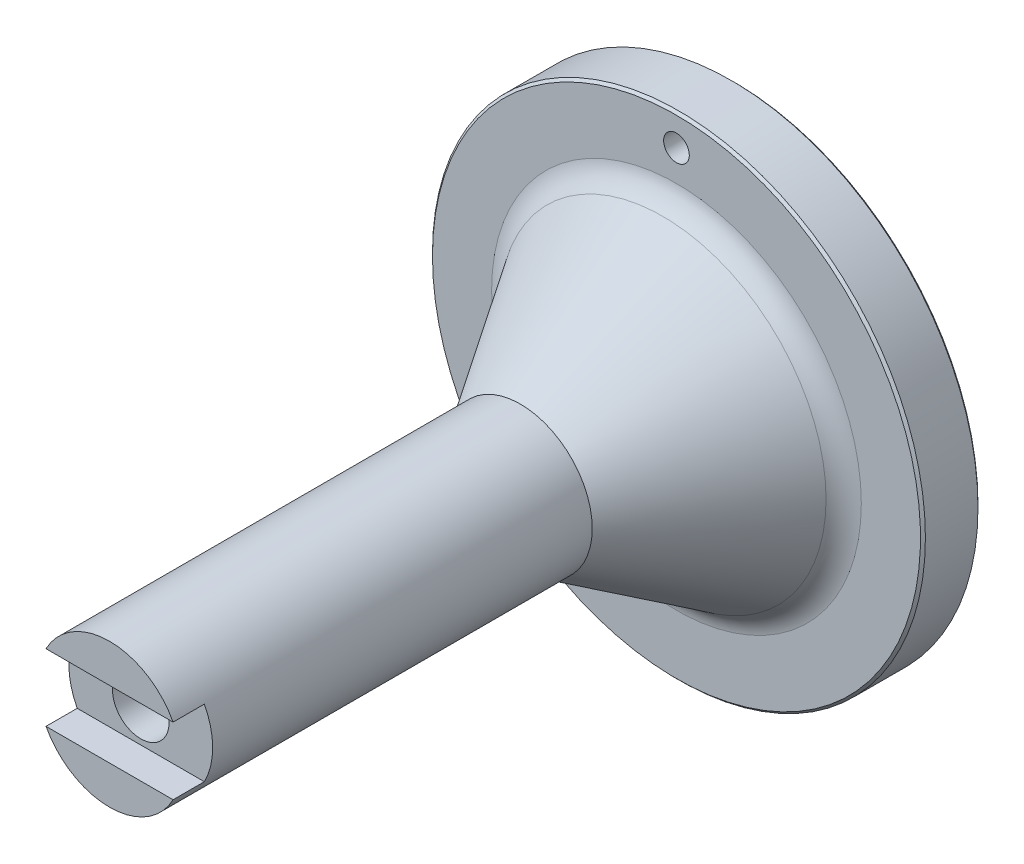
ISO-10303-21;
HEADER;
FILE_DESCRIPTION(('STEP AP214'),'2;1');
FILE_NAME('part.step','',(''),(''),'','','');
FILE_SCHEMA(('AUTOMOTIVE_DESIGN { 1 0 10303 214 1 1 1 1 }'));
ENDSEC;
DATA;
#1=APPLICATION_CONTEXT('core data for automotive mechanical design processes');
#2=APPLICATION_PROTOCOL_DEFINITION('international standard','automotive_design',2000,#1);
#3=PRODUCT_CONTEXT('',#1,'mechanical');
#4=PRODUCT('Part','Part','',(#3));
#5=PRODUCT_RELATED_PRODUCT_CATEGORY('part','',(#4));
#6=PRODUCT_DEFINITION_FORMATION('','',#4);
#7=PRODUCT_DEFINITION_CONTEXT('part definition',#1,'design');
#8=PRODUCT_DEFINITION('design','',#6,#7);
#9=PRODUCT_DEFINITION_SHAPE('','',#8);
#10=(LENGTH_UNIT() NAMED_UNIT(*) SI_UNIT(.MILLI.,.METRE.));
#11=(NAMED_UNIT(*) PLANE_ANGLE_UNIT() SI_UNIT($,.RADIAN.));
#12=(NAMED_UNIT(*) SI_UNIT($,.STERADIAN.) SOLID_ANGLE_UNIT());
#13=UNCERTAINTY_MEASURE_WITH_UNIT(LENGTH_MEASURE(1.E-05),#10,'distance_accuracy_value','');
#14=(GEOMETRIC_REPRESENTATION_CONTEXT(3) GLOBAL_UNCERTAINTY_ASSIGNED_CONTEXT((#13)) GLOBAL_UNIT_ASSIGNED_CONTEXT((#10,
#11,#12)) REPRESENTATION_CONTEXT('',''));
#15=CARTESIAN_POINT('',(0.,0.,0.));
#16=DIRECTION('',(0.,0.,1.));
#17=DIRECTION('',(1.,0.,0.));
#18=AXIS2_PLACEMENT_3D('',#15,#16,#17);
#19=CARTESIAN_POINT('',(0.,8.7376,0.));
#20=DIRECTION('',(0.,0.,-1.));
#21=DIRECTION('',(-1.,0.,0.));
#22=AXIS2_PLACEMENT_3D('',#19,#20,#21);
#23=PLANE('',#22);
#24=CARTESIAN_POINT('',(0.,0.,0.));
#25=DIRECTION('',(0.,0.,1.));
#26=DIRECTION('',(1.,0.,0.));
#27=AXIS2_PLACEMENT_3D('',#24,#25,#26);
#28=CIRCLE('',#27,22.225);
#29=CARTESIAN_POINT('',(19.6475854760833,10.3886,0.));
#30=VERTEX_POINT('',#29);
#31=CARTESIAN_POINT('',(-19.6475854760833,10.3886,0.));
#32=VERTEX_POINT('',#31);
#33=EDGE_CURVE('E141',#30,#32,#28,.T.);
#34=ORIENTED_EDGE('',*,*,#33,.T.);
#35=DIRECTION('',(1.,0.,0.));
#36=VECTOR('',#35,1.);
#37=CARTESIAN_POINT('',(-76.2,10.3886,0.));
#38=LINE('',#37,#36);
#39=EDGE_CURVE('E87',#32,#30,#38,.T.);
#40=ORIENTED_EDGE('',*,*,#39,.T.);
#41=EDGE_LOOP('',(#34,#40));
#42=FACE_BOUND('',#41,.T.);
#43=ADVANCED_FACE('F40',(#42),#23,.F.);
#44=CARTESIAN_POINT('',(0.,0.,0.));
#45=DIRECTION('',(0.,0.,1.));
#46=DIRECTION('',(1.,0.,0.));
#47=AXIS2_PLACEMENT_3D('',#44,#45,#46);
#48=CYLINDRICAL_SURFACE('',#47,22.225);
#49=ORIENTED_EDGE('',*,*,#33,.F.);
#50=DIRECTION('',(0.,0.,1.));
#51=VECTOR('',#50,1.);
#52=CARTESIAN_POINT('',(19.6475854760833,10.3886,0.));
#53=LINE('',#52,#51);
#54=CARTESIAN_POINT('',(19.6475854760833,10.3886,-9.652));
#55=VERTEX_POINT('',#54);
#56=EDGE_CURVE('E65',#30,#55,#53,.F.);
#57=ORIENTED_EDGE('',*,*,#56,.T.);
#58=CARTESIAN_POINT('',(0.,0.,-9.652));
#59=DIRECTION('',(0.,0.,-1.));
#60=DIRECTION('',(0.,1.,0.));
#61=AXIS2_PLACEMENT_3D('',#58,#59,#60);
#62=CIRCLE('',#61,22.225);
#63=CARTESIAN_POINT('',(19.6475854760833,-10.3886,-9.652));
#64=VERTEX_POINT('',#63);
#65=EDGE_CURVE('E99',#55,#64,#62,.T.);
#66=ORIENTED_EDGE('',*,*,#65,.T.);
#67=DIRECTION('',(0.,0.,1.));
#68=VECTOR('',#67,1.);
#69=CARTESIAN_POINT('',(19.6475854760833,-10.3886,0.));
#70=LINE('',#69,#68);
#71=CARTESIAN_POINT('',(19.6475854760833,-10.3886,0.));
#72=VERTEX_POINT('',#71);
#73=EDGE_CURVE('E113',#64,#72,#70,.T.);
#74=ORIENTED_EDGE('',*,*,#73,.T.);
#75=CARTESIAN_POINT('',(-19.6475854760833,-10.3886,0.));
#76=VERTEX_POINT('',#75);
#77=EDGE_CURVE('E140',#76,#72,#28,.T.);
#78=ORIENTED_EDGE('',*,*,#77,.F.);
#79=DIRECTION('',(0.,0.,1.));
#80=VECTOR('',#79,1.);
#81=CARTESIAN_POINT('',(-19.6475854760833,-10.3886,0.));
#82=LINE('',#81,#80);
#83=CARTESIAN_POINT('',(-19.6475854760833,-10.3886,-9.652));
#84=VERTEX_POINT('',#83);
#85=EDGE_CURVE('E57',#76,#84,#82,.F.);
#86=ORIENTED_EDGE('',*,*,#85,.T.);
#87=CARTESIAN_POINT('',(-19.6475854760833,10.3886,-9.652));
#88=VERTEX_POINT('',#87);
#89=EDGE_CURVE('E97',#84,#88,#62,.T.);
#90=ORIENTED_EDGE('',*,*,#89,.T.);
#91=DIRECTION('',(0.,0.,1.));
#92=VECTOR('',#91,1.);
#93=CARTESIAN_POINT('',(-19.6475854760833,10.3886,0.));
#94=LINE('',#93,#92);
#95=EDGE_CURVE('E83',#88,#32,#94,.T.);
#96=ORIENTED_EDGE('',*,*,#95,.T.);
#97=EDGE_LOOP('',(#49,#57,#66,#74,#78,#86,#90,#96));
#98=FACE_BOUND('',#97,.T.);
#99=CARTESIAN_POINT('',(0.,0.,-127.));
#100=DIRECTION('',(0.,0.,1.));
#101=DIRECTION('',(1.,0.,0.));
#102=AXIS2_PLACEMENT_3D('',#99,#100,#101);
#103=CIRCLE('',#102,22.225);
#104=CARTESIAN_POINT('',(22.225,0.,-127.));
#105=VERTEX_POINT('',#104);
#106=EDGE_CURVE('E92',#105,#105,#103,.T.);
#107=ORIENTED_EDGE('',*,*,#106,.T.);
#108=EDGE_LOOP('',(#107));
#109=FACE_BOUND('',#108,.T.);
#110=ADVANCED_FACE('F102',(#98,#109),#48,.T.);
#111=ORIENTED_EDGE('',*,*,#77,.T.);
#112=DIRECTION('',(1.,0.,0.));
#113=VECTOR('',#112,1.);
#114=CARTESIAN_POINT('',(-76.2,-10.3886,0.));
#115=LINE('',#114,#113);
#116=EDGE_CURVE('E110',#76,#72,#115,.T.);
#117=ORIENTED_EDGE('',*,*,#116,.F.);
#118=EDGE_LOOP('',(#111,#117));
#119=FACE_BOUND('',#118,.T.);
#120=ADVANCED_FACE('F191',(#119),#23,.F.);
#121=CARTESIAN_POINT('',(0.,0.,0.));
#122=DIRECTION('',(0.,0.,1.));
#123=DIRECTION('',(1.,0.,0.));
#124=AXIS2_PLACEMENT_3D('',#121,#122,#123);
#125=CYLINDRICAL_SURFACE('',#124,8.7376);
#126=CARTESIAN_POINT('',(0.,0.,-9.652));
#127=DIRECTION('',(0.,0.,-1.));
#128=DIRECTION('',(0.,1.,0.));
#129=AXIS2_PLACEMENT_3D('',#126,#127,#128);
#130=CIRCLE('',#129,8.7376);
#131=CARTESIAN_POINT('',(0.,8.7376,-9.652));
#132=VERTEX_POINT('',#131);
#133=EDGE_CURVE('E105',#132,#132,#130,.F.);
#134=ORIENTED_EDGE('',*,*,#133,.T.);
#135=EDGE_LOOP('',(#134));
#136=FACE_BOUND('',#135,.T.);
#137=CARTESIAN_POINT('',(0.,0.,-185.1152));
#138=DIRECTION('',(0.,0.,1.));
#139=DIRECTION('',(1.,0.,0.));
#140=AXIS2_PLACEMENT_3D('',#137,#138,#139);
#141=CIRCLE('',#140,8.7376);
#142=CARTESIAN_POINT('',(8.7376,0.,-185.1152));
#143=VERTEX_POINT('',#142);
#144=EDGE_CURVE('E137',#143,#143,#141,.T.);
#145=ORIENTED_EDGE('',*,*,#144,.F.);
#146=EDGE_LOOP('',(#145));
#147=FACE_BOUND('',#146,.T.);
#148=ADVANCED_FACE('F198',(#136,#147),#125,.F.);
#149=CARTESIAN_POINT('',(0.,15.875,-185.1152));
#150=DIRECTION('',(0.,0.,1.));
#151=DIRECTION('',(1.,0.,0.));
#152=AXIS2_PLACEMENT_3D('',#149,#150,#151);
#153=PLANE('',#152);
#154=CARTESIAN_POINT('',(0.,0.,-185.1152));
#155=DIRECTION('',(0.,0.,1.));
#156=DIRECTION('',(1.,0.,0.));
#157=AXIS2_PLACEMENT_3D('',#154,#155,#156);
#158=CIRCLE('',#157,15.875);
#159=CARTESIAN_POINT('',(15.875,0.,-185.1152));
#160=VERTEX_POINT('',#159);
#161=EDGE_CURVE('E134',#160,#160,#158,.T.);
#162=ORIENTED_EDGE('',*,*,#161,.F.);
#163=EDGE_LOOP('',(#162));
#164=FACE_BOUND('',#163,.T.);
#165=ORIENTED_EDGE('',*,*,#144,.T.);
#166=EDGE_LOOP('',(#165));
#167=FACE_BOUND('',#166,.T.);
#168=ADVANCED_FACE('F203',(#164,#167),#153,.F.);
#169=CARTESIAN_POINT('',(0.,0.,-185.1152));
#170=DIRECTION('',(0.,0.,1.));
#171=DIRECTION('',(1.,0.,0.));
#172=AXIS2_PLACEMENT_3D('',#169,#170,#171);
#173=CONICAL_SURFACE('',#172,15.875,0.785398163397444);
#174=CARTESIAN_POINT('',(0.,0.,-171.452793139199));
#175=DIRECTION('',(0.,0.,1.));
#176=DIRECTION('',(1.,0.,0.));
#177=AXIS2_PLACEMENT_3D('',#174,#175,#176);
#178=CIRCLE('',#177,29.5374068608008);
#179=CARTESIAN_POINT('',(29.5374068608008,0.,-171.452793139199));
#180=VERTEX_POINT('',#179);
#181=EDGE_CURVE('E131',#180,#180,#178,.T.);
#182=ORIENTED_EDGE('',*,*,#181,.F.);
#183=EDGE_LOOP('',(#182));
#184=FACE_BOUND('',#183,.T.);
#185=ORIENTED_EDGE('',*,*,#161,.T.);
#186=EDGE_LOOP('',(#185));
#187=FACE_BOUND('',#186,.T.);
#188=ADVANCED_FACE('F346',(#184,#187),#173,.T.);
#189=CARTESIAN_POINT('',(0.,0.,-178.187985230001));
#190=DIRECTION('',(0.,0.,1.));
#191=DIRECTION('',(1.,0.,0.));
#192=AXIS2_PLACEMENT_3D('',#189,#190,#191);
#193=TOROIDAL_SURFACE('',#192,36.2725989516027,9.52499999999998);
#194=CARTESIAN_POINT('',(0.,0.,-173.035490372764));
#195=DIRECTION('',(0.,0.,1.));
#196=DIRECTION('',(1.,0.,0.));
#197=AXIS2_PLACEMENT_3D('',#194,#195,#196);
#198=CIRCLE('',#197,44.2836801361961);
#199=CARTESIAN_POINT('',(44.2836801361961,0.,-173.035490372764));
#200=VERTEX_POINT('',#199);
#201=EDGE_CURVE('E128',#200,#200,#198,.T.);
#202=ORIENTED_EDGE('',*,*,#201,.F.);
#203=EDGE_LOOP('',(#202));
#204=FACE_BOUND('',#203,.T.);
#205=ORIENTED_EDGE('',*,*,#181,.T.);
#206=EDGE_LOOP('',(#205));
#207=FACE_BOUND('',#206,.T.);
#208=ADVANCED_FACE('F355',(#204,#207),#193,.F.);
#209=CARTESIAN_POINT('',(0.,0.,-173.035490372764));
#210=DIRECTION('',(0.,0.,-1.));
#211=DIRECTION('',(-1.,0.,0.));
#212=AXIS2_PLACEMENT_3D('',#209,#210,#211);
#213=CONICAL_SURFACE('',#212,44.2836801361961,0.571559506417965);
#214=CARTESIAN_POINT('',(0.,0.,-193.04));
#215=DIRECTION('',(0.,0.,1.));
#216=DIRECTION('',(1.,0.,0.));
#217=AXIS2_PLACEMENT_3D('',#214,#215,#216);
#218=CIRCLE('',#217,57.15);
#219=CARTESIAN_POINT('',(57.15,0.,-193.04));
#220=VERTEX_POINT('',#219);
#221=EDGE_CURVE('E125',#220,#220,#218,.T.);
#222=ORIENTED_EDGE('',*,*,#221,.F.);
#223=EDGE_LOOP('',(#222));
#224=FACE_BOUND('',#223,.T.);
#225=ORIENTED_EDGE('',*,*,#201,.T.);
#226=EDGE_LOOP('',(#225));
#227=FACE_BOUND('',#226,.T.);
#228=ADVANCED_FACE('F261',(#224,#227),#213,.F.);
#229=CARTESIAN_POINT('',(0.,76.2,-193.04));
#230=DIRECTION('',(0.,0.,1.));
#231=DIRECTION('',(1.,0.,0.));
#232=AXIS2_PLACEMENT_3D('',#229,#230,#231);
#233=PLANE('',#232);
#234=CARTESIAN_POINT('',(0.,66.675,-193.04));
#235=DIRECTION('',(0.,0.,-1.));
#236=DIRECTION('',(-1.,0.,0.));
#237=AXIS2_PLACEMENT_3D('',#234,#235,#236);
#238=CIRCLE('',#237,3.9624);
#239=CARTESIAN_POINT('',(-3.9624,66.675,-193.04));
#240=VERTEX_POINT('',#239);
#241=EDGE_CURVE('E209',#240,#240,#238,.T.);
#242=ORIENTED_EDGE('',*,*,#241,.F.);
#243=EDGE_LOOP('',(#242));
#244=FACE_BOUND('',#243,.T.);
#245=CARTESIAN_POINT('',(0.,0.,-193.04));
#246=DIRECTION('',(0.,0.,1.));
#247=DIRECTION('',(1.,0.,0.));
#248=AXIS2_PLACEMENT_3D('',#245,#246,#247);
#249=CIRCLE('',#248,75.438);
#250=CARTESIAN_POINT('',(75.438,0.,-193.04));
#251=VERTEX_POINT('',#250);
#252=EDGE_CURVE('E49',#251,#251,#249,.F.);
#253=ORIENTED_EDGE('',*,*,#252,.T.);
#254=EDGE_LOOP('',(#253));
#255=FACE_BOUND('',#254,.T.);
#256=ORIENTED_EDGE('',*,*,#221,.T.);
#257=EDGE_LOOP('',(#256));
#258=FACE_BOUND('',#257,.T.);
#259=ADVANCED_FACE('F152',(#244,#255,#258),#233,.F.);
#260=CARTESIAN_POINT('',(0.,0.,0.));
#261=DIRECTION('',(0.,0.,1.));
#262=DIRECTION('',(1.,0.,0.));
#263=AXIS2_PLACEMENT_3D('',#260,#261,#262);
#264=CYLINDRICAL_SURFACE('',#263,76.2);
#265=CARTESIAN_POINT('',(0.,0.,-192.278));
#266=DIRECTION('',(0.,0.,1.));
#267=DIRECTION('',(1.,0.,0.));
#268=AXIS2_PLACEMENT_3D('',#265,#266,#267);
#269=CIRCLE('',#268,76.2);
#270=CARTESIAN_POINT('',(76.2,0.,-192.278));
#271=VERTEX_POINT('',#270);
#272=EDGE_CURVE('E146',#271,#271,#269,.T.);
#273=ORIENTED_EDGE('',*,*,#272,.T.);
#274=EDGE_LOOP('',(#273));
#275=FACE_BOUND('',#274,.T.);
#276=CARTESIAN_POINT('',(0.,0.,-176.022));
#277=DIRECTION('',(0.,0.,-1.));
#278=DIRECTION('',(-1.,0.,0.));
#279=AXIS2_PLACEMENT_3D('',#276,#277,#278);
#280=CIRCLE('',#279,76.2);
#281=CARTESIAN_POINT('',(-76.2,0.,-176.022));
#282=VERTEX_POINT('',#281);
#283=EDGE_CURVE('E143',#282,#282,#280,.T.);
#284=ORIENTED_EDGE('',*,*,#283,.T.);
#285=EDGE_LOOP('',(#284));
#286=FACE_BOUND('',#285,.T.);
#287=ADVANCED_FACE('F161',(#275,#286),#264,.T.);
#288=CARTESIAN_POINT('',(0.,57.15,-175.26));
#289=DIRECTION('',(0.,0.,-1.));
#290=DIRECTION('',(-1.,0.,0.));
#291=AXIS2_PLACEMENT_3D('',#288,#289,#290);
#292=PLANE('',#291);
#293=CARTESIAN_POINT('',(0.,66.675,-175.26));
#294=DIRECTION('',(0.,0.,-1.));
#295=DIRECTION('',(-1.,0.,0.));
#296=AXIS2_PLACEMENT_3D('',#293,#294,#295);
#297=CIRCLE('',#296,3.9624);
#298=CARTESIAN_POINT('',(-3.9624,66.675,-175.26));
#299=VERTEX_POINT('',#298);
#300=EDGE_CURVE('E44',#299,#299,#297,.T.);
#301=ORIENTED_EDGE('',*,*,#300,.T.);
#302=EDGE_LOOP('',(#301));
#303=FACE_BOUND('',#302,.T.);
#304=CARTESIAN_POINT('',(0.,0.,-175.26));
#305=DIRECTION('',(0.,0.,-1.));
#306=DIRECTION('',(-1.,0.,0.));
#307=AXIS2_PLACEMENT_3D('',#304,#305,#306);
#308=CIRCLE('',#307,75.4379999999999);
#309=CARTESIAN_POINT('',(-75.4379999999999,0.,-175.26));
#310=VERTEX_POINT('',#309);
#311=EDGE_CURVE('E11',#310,#310,#308,.F.);
#312=ORIENTED_EDGE('',*,*,#311,.T.);
#313=EDGE_LOOP('',(#312));
#314=FACE_BOUND('',#313,.T.);
#315=CARTESIAN_POINT('',(0.,0.,-175.26));
#316=DIRECTION('',(0.,0.,1.));
#317=DIRECTION('',(1.,0.,0.));
#318=AXIS2_PLACEMENT_3D('',#315,#316,#317);
#319=CIRCLE('',#318,57.15);
#320=CARTESIAN_POINT('',(57.15,0.,-175.26));
#321=VERTEX_POINT('',#320);
#322=EDGE_CURVE('E122',#321,#321,#319,.T.);
#323=ORIENTED_EDGE('',*,*,#322,.F.);
#324=EDGE_LOOP('',(#323));
#325=FACE_BOUND('',#324,.T.);
#326=ADVANCED_FACE('F164',(#303,#314,#325),#292,.F.);
#327=CARTESIAN_POINT('',(0.,0.,-165.83515658389));
#328=DIRECTION('',(0.,0.,1.));
#329=DIRECTION('',(1.,0.,0.));
#330=AXIS2_PLACEMENT_3D('',#327,#328,#329);
#331=TOROIDAL_SURFACE('',#330,58.5276616354586,9.52499999999999);
#332=CARTESIAN_POINT('',(0.,0.,-170.987651441127));
#333=DIRECTION('',(0.,0.,1.));
#334=DIRECTION('',(1.,0.,0.));
#335=AXIS2_PLACEMENT_3D('',#332,#333,#334);
#336=CIRCLE('',#335,50.5165804508652);
#337=CARTESIAN_POINT('',(50.5165804508652,0.,-170.987651441127));
#338=VERTEX_POINT('',#337);
#339=EDGE_CURVE('E119',#338,#338,#336,.T.);
#340=ORIENTED_EDGE('',*,*,#339,.F.);
#341=EDGE_LOOP('',(#340));
#342=FACE_BOUND('',#341,.T.);
#343=ORIENTED_EDGE('',*,*,#322,.T.);
#344=EDGE_LOOP('',(#343));
#345=FACE_BOUND('',#344,.T.);
#346=ADVANCED_FACE('F174',(#342,#345),#331,.F.);
#347=CARTESIAN_POINT('',(0.,0.,-170.987651441127));
#348=DIRECTION('',(0.,0.,-1.));
#349=DIRECTION('',(-1.,0.,0.));
#350=AXIS2_PLACEMENT_3D('',#347,#348,#349);
#351=CONICAL_SURFACE('',#350,50.5165804508652,0.571559506417964);
#352=ORIENTED_EDGE('',*,*,#106,.F.);
#353=EDGE_LOOP('',(#352));
#354=FACE_BOUND('',#353,.T.);
#355=ORIENTED_EDGE('',*,*,#339,.T.);
#356=EDGE_LOOP('',(#355));
#357=FACE_BOUND('',#356,.T.);
#358=ADVANCED_FACE('F158',(#354,#357),#351,.T.);
#359=CARTESIAN_POINT('',(0.,0.,-192.278));
#360=DIRECTION('',(0.,0.,1.));
#361=DIRECTION('',(1.,0.,0.));
#362=AXIS2_PLACEMENT_3D('',#359,#360,#361);
#363=CONICAL_SURFACE('',#362,76.2,0.785398163397448);
#364=CARTESIAN_POINT('',(75.438,0.,-193.04));
#365=CARTESIAN_POINT('',(75.4459375,0.,-193.0320625));
#366=CARTESIAN_POINT('',(75.453875,0.,-193.024125));
#367=CARTESIAN_POINT('',(75.46975,0.,-193.00825));
#368=CARTESIAN_POINT('',(75.4776875,0.,-193.0003125));
#369=CARTESIAN_POINT('',(75.4935625,0.,-192.9844375));
#370=CARTESIAN_POINT('',(75.5015,0.,-192.9765));
#371=CARTESIAN_POINT('',(75.517375,0.,-192.960625));
#372=CARTESIAN_POINT('',(75.5253125,0.,-192.9526875));
#373=CARTESIAN_POINT('',(75.5411875,0.,-192.9368125));
#374=CARTESIAN_POINT('',(75.549125,0.,-192.928875));
#375=CARTESIAN_POINT('',(75.565,0.,-192.913));
#376=CARTESIAN_POINT('',(75.5729375,0.,-192.9050625));
#377=CARTESIAN_POINT('',(75.5888125,0.,-192.8891875));
#378=CARTESIAN_POINT('',(75.59675,0.,-192.88125));
#379=CARTESIAN_POINT('',(75.612625,0.,-192.865375));
#380=CARTESIAN_POINT('',(75.6205625,0.,-192.8574375));
#381=CARTESIAN_POINT('',(75.6364375,0.,-192.8415625));
#382=CARTESIAN_POINT('',(75.644375,0.,-192.833625));
#383=CARTESIAN_POINT('',(75.66025,0.,-192.81775));
#384=CARTESIAN_POINT('',(75.6681875,0.,-192.8098125));
#385=CARTESIAN_POINT('',(75.6840625,0.,-192.7939375));
#386=CARTESIAN_POINT('',(75.692,0.,-192.786));
#387=CARTESIAN_POINT('',(75.707875,0.,-192.770125));
#388=CARTESIAN_POINT('',(75.7158125,0.,-192.7621875));
#389=CARTESIAN_POINT('',(75.7316875,0.,-192.7463125));
#390=CARTESIAN_POINT('',(75.739625,0.,-192.738375));
#391=CARTESIAN_POINT('',(75.7555,0.,-192.7225));
#392=CARTESIAN_POINT('',(75.7634375,0.,-192.7145625));
#393=CARTESIAN_POINT('',(75.7793125,0.,-192.6986875));
#394=CARTESIAN_POINT('',(75.78725,0.,-192.69075));
#395=CARTESIAN_POINT('',(75.803125,0.,-192.674875));
#396=CARTESIAN_POINT('',(75.8110625,0.,-192.6669375));
#397=CARTESIAN_POINT('',(75.8269375,0.,-192.6510625));
#398=CARTESIAN_POINT('',(75.834875,0.,-192.643125));
#399=CARTESIAN_POINT('',(75.85075,0.,-192.62725));
#400=CARTESIAN_POINT('',(75.8586875,0.,-192.6193125));
#401=CARTESIAN_POINT('',(75.8745625,0.,-192.6034375));
#402=CARTESIAN_POINT('',(75.8825,0.,-192.5955));
#403=CARTESIAN_POINT('',(75.898375,0.,-192.579625));
#404=CARTESIAN_POINT('',(75.9063125,0.,-192.5716875));
#405=CARTESIAN_POINT('',(75.9221875,0.,-192.5558125));
#406=CARTESIAN_POINT('',(75.930125,0.,-192.547875));
#407=CARTESIAN_POINT('',(75.946,0.,-192.532));
#408=CARTESIAN_POINT('',(75.9539375,0.,-192.5240625));
#409=CARTESIAN_POINT('',(75.9698125,0.,-192.5081875));
#410=CARTESIAN_POINT('',(75.97775,0.,-192.50025));
#411=CARTESIAN_POINT('',(75.993625,0.,-192.484375));
#412=CARTESIAN_POINT('',(76.0015625,0.,-192.4764375));
#413=CARTESIAN_POINT('',(76.0174375,0.,-192.4605625));
#414=CARTESIAN_POINT('',(76.025375,0.,-192.452625));
#415=CARTESIAN_POINT('',(76.04125,0.,-192.43675));
#416=CARTESIAN_POINT('',(76.0491875,0.,-192.4288125));
#417=CARTESIAN_POINT('',(76.0650625,0.,-192.4129375));
#418=CARTESIAN_POINT('',(76.073,0.,-192.405));
#419=CARTESIAN_POINT('',(76.088875,0.,-192.389125));
#420=CARTESIAN_POINT('',(76.0968125,0.,-192.3811875));
#421=CARTESIAN_POINT('',(76.1126875,0.,-192.3653125));
#422=CARTESIAN_POINT('',(76.120625,0.,-192.357375));
#423=CARTESIAN_POINT('',(76.1365,0.,-192.3415));
#424=CARTESIAN_POINT('',(76.1444375,0.,-192.3335625));
#425=CARTESIAN_POINT('',(76.1603125,0.,-192.3176875));
#426=CARTESIAN_POINT('',(76.16825,0.,-192.30975));
#427=CARTESIAN_POINT('',(76.184125,0.,-192.293875));
#428=CARTESIAN_POINT('',(76.1920625,0.,-192.2859375));
#429=CARTESIAN_POINT('',(76.2,0.,-192.278));
#430=B_SPLINE_CURVE_WITH_KNOTS('',3,(#364,#365,#366,#367,#368,#369,#370,#371,#372,#373,#374,
#375,#376,#377,#378,#379,#380,#381,#382,#383,#384,#385,#386,#387,#388,#389,#390,#391,#392,#393,
#394,#395,#396,#397,#398,#399,#400,#401,#402,#403,#404,#405,#406,#407,#408,#409,#410,#411,#412,
#413,#414,#415,#416,#417,#418,#419,#420,#421,#422,#423,#424,#425,#426,#427,#428,#429),
.UNSPECIFIED.,.F.,.F.,(4,2,2,2,2,2,2,2,2,2,2,2,2,2,2,2,2,2,2,2,2,2,2,2,2,2,2,2,2,2,2,2,4),(0.,
0.0336759604540062,0.0673519209080124,0.101027881362028,0.134703841816035,0.168379802270041,
0.202055762724047,0.235731723178053,0.269407683632059,0.303083644086075,0.336759604540082,
0.370435564994107,0.404111525448114,0.43778748590212,0.471463446356136,0.505139406810142,
0.538815367264148,0.572491327718154,0.606167288172161,0.639843248626177,0.673519209080183,
0.707195169534189,0.740871129988215,0.774547090442221,0.808223050896237,0.841899011350243,
0.87557497180425,0.909250932258256,0.942926892712262,0.976602853166268,1.01027881362028,
1.04395477407429,1.07763073452832),.UNSPECIFIED.);
#431=EDGE_CURVE('BSEAM155',#251,#271,#430,.T.);
#432=ORIENTED_EDGE('',*,*,#252,.F.);
#433=ORIENTED_EDGE('',*,*,#272,.F.);
#434=ORIENTED_EDGE('',*,*,#431,.T.);
#435=ORIENTED_EDGE('',*,*,#431,.F.);
#436=EDGE_LOOP('',(#432,#434,#433,#435));
#437=FACE_BOUND('',#436,.T.);
#438=ADVANCED_FACE('F155',(#437),#363,.T.);
#439=CARTESIAN_POINT('',(0.,0.,-175.26));
#440=DIRECTION('',(0.,0.,-1.));
#441=DIRECTION('',(-1.,0.,0.));
#442=AXIS2_PLACEMENT_3D('',#439,#440,#441);
#443=CONICAL_SURFACE('',#442,75.4379999999999,0.785398163397485);
#444=ORIENTED_EDGE('',*,*,#283,.F.);
#445=EDGE_LOOP('',(#444));
#446=FACE_BOUND('',#445,.T.);
#447=ORIENTED_EDGE('',*,*,#311,.F.);
#448=EDGE_LOOP('',(#447));
#449=FACE_BOUND('',#448,.T.);
#450=ADVANCED_FACE('F42',(#446,#449),#443,.T.);
#451=CARTESIAN_POINT('',(-76.2,10.3886,-9.652));
#452=DIRECTION('',(0.,1.,0.));
#453=DIRECTION('',(0.,0.,1.));
#454=AXIS2_PLACEMENT_3D('',#451,#452,#453);
#455=PLANE('',#454);
#456=DIRECTION('',(1.,0.,0.));
#457=VECTOR('',#456,1.);
#458=CARTESIAN_POINT('',(-76.2,10.3886,-9.652));
#459=LINE('',#458,#457);
#460=EDGE_CURVE('E86',#88,#55,#459,.T.);
#461=ORIENTED_EDGE('',*,*,#460,.T.);
#462=ORIENTED_EDGE('',*,*,#56,.F.);
#463=ORIENTED_EDGE('',*,*,#39,.F.);
#464=ORIENTED_EDGE('',*,*,#95,.F.);
#465=EDGE_LOOP('',(#461,#462,#463,#464));
#466=FACE_BOUND('',#465,.T.);
#467=ADVANCED_FACE('F85',(#466),#455,.F.);
#468=CARTESIAN_POINT('',(-76.2,-10.3886,-9.652));
#469=DIRECTION('',(0.,-1.,0.));
#470=DIRECTION('',(0.,0.,-1.));
#471=AXIS2_PLACEMENT_3D('',#468,#469,#470);
#472=PLANE('',#471);
#473=DIRECTION('',(1.,0.,0.));
#474=VECTOR('',#473,1.);
#475=CARTESIAN_POINT('',(-76.2,-10.3886,-9.652));
#476=LINE('',#475,#474);
#477=EDGE_CURVE('E100',#84,#64,#476,.T.);
#478=ORIENTED_EDGE('',*,*,#477,.F.);
#479=ORIENTED_EDGE('',*,*,#85,.F.);
#480=ORIENTED_EDGE('',*,*,#116,.T.);
#481=ORIENTED_EDGE('',*,*,#73,.F.);
#482=EDGE_LOOP('',(#478,#479,#480,#481));
#483=FACE_BOUND('',#482,.T.);
#484=ADVANCED_FACE('F206',(#483),#472,.F.);
#485=CARTESIAN_POINT('',(-76.2,-10.3886,-9.652));
#486=DIRECTION('',(0.,0.,-1.));
#487=DIRECTION('',(0.,1.,0.));
#488=AXIS2_PLACEMENT_3D('',#485,#486,#487);
#489=PLANE('',#488);
#490=ORIENTED_EDGE('',*,*,#133,.F.);
#491=EDGE_LOOP('',(#490));
#492=FACE_BOUND('',#491,.T.);
#493=ORIENTED_EDGE('',*,*,#460,.F.);
#494=ORIENTED_EDGE('',*,*,#89,.F.);
#495=ORIENTED_EDGE('',*,*,#477,.T.);
#496=ORIENTED_EDGE('',*,*,#65,.F.);
#497=EDGE_LOOP('',(#493,#494,#495,#496));
#498=FACE_BOUND('',#497,.T.);
#499=ADVANCED_FACE('F95',(#492,#498),#489,.F.);
#500=CARTESIAN_POINT('',(0.,66.675,0.));
#501=DIRECTION('',(0.,0.,-1.));
#502=DIRECTION('',(-1.,0.,0.));
#503=AXIS2_PLACEMENT_3D('',#500,#501,#502);
#504=CYLINDRICAL_SURFACE('',#503,3.9624);
#505=ORIENTED_EDGE('',*,*,#241,.T.);
#506=EDGE_LOOP('',(#505));
#507=FACE_BOUND('',#506,.T.);
#508=ORIENTED_EDGE('',*,*,#300,.F.);
#509=EDGE_LOOP('',(#508));
#510=FACE_BOUND('',#509,.T.);
#511=ADVANCED_FACE('F216',(#507,#510),#504,.F.);
#512=CLOSED_SHELL('',(#43,#110,#120,#148,#168,#188,#208,#228,#259,#287,#326,#346,#358,#438,#450,
#467,#484,#499,#511));
#513=MANIFOLD_SOLID_BREP('B2',#512);
#514=ADVANCED_BREP_SHAPE_REPRESENTATION('',(#18,#513),#14);
#515=SHAPE_DEFINITION_REPRESENTATION(#9,#514);
ENDSEC;
END-ISO-10303-21;
